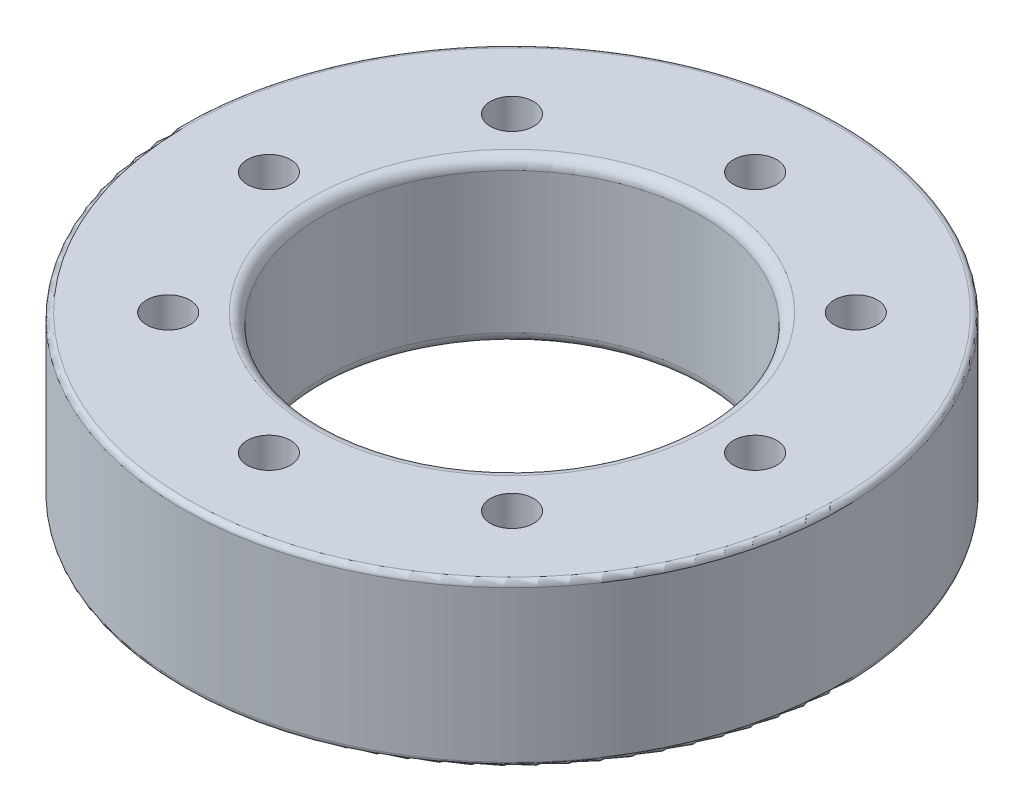
ISO-10303-21;
HEADER;
FILE_DESCRIPTION(('STEP AP214'),'2;1');
FILE_NAME('part.step','',(''),(''),'','','');
FILE_SCHEMA(('AUTOMOTIVE_DESIGN { 1 0 10303 214 1 1 1 1 }'));
ENDSEC;
DATA;
#1=APPLICATION_CONTEXT('core data for automotive mechanical design processes');
#2=APPLICATION_PROTOCOL_DEFINITION('international standard','automotive_design',2000,#1);
#3=PRODUCT_CONTEXT('',#1,'mechanical');
#4=PRODUCT('Part','Part','',(#3));
#5=PRODUCT_RELATED_PRODUCT_CATEGORY('part','',(#4));
#6=PRODUCT_DEFINITION_FORMATION('','',#4);
#7=PRODUCT_DEFINITION_CONTEXT('part definition',#1,'design');
#8=PRODUCT_DEFINITION('design','',#6,#7);
#9=PRODUCT_DEFINITION_SHAPE('','',#8);
#10=(LENGTH_UNIT() NAMED_UNIT(*) SI_UNIT(.MILLI.,.METRE.));
#11=(NAMED_UNIT(*) PLANE_ANGLE_UNIT() SI_UNIT($,.RADIAN.));
#12=(NAMED_UNIT(*) SI_UNIT($,.STERADIAN.) SOLID_ANGLE_UNIT());
#13=UNCERTAINTY_MEASURE_WITH_UNIT(LENGTH_MEASURE(1.E-05),#10,'distance_accuracy_value','');
#14=(GEOMETRIC_REPRESENTATION_CONTEXT(3) GLOBAL_UNCERTAINTY_ASSIGNED_CONTEXT((#13)) GLOBAL_UNIT_ASSIGNED_CONTEXT((#10,
#11,#12)) REPRESENTATION_CONTEXT('',''));
#15=CARTESIAN_POINT('',(0.,0.,0.));
#16=DIRECTION('',(0.,0.,1.));
#17=DIRECTION('',(1.,0.,0.));
#18=AXIS2_PLACEMENT_3D('',#15,#16,#17);
#19=CARTESIAN_POINT('',(0.,15.,0.));
#20=DIRECTION('',(0.,1.,0.));
#21=DIRECTION('',(0.,0.,1.));
#22=AXIS2_PLACEMENT_3D('',#19,#20,#21);
#23=PLANE('',#22);
#24=CARTESIAN_POINT('',(0.,15.,0.));
#25=DIRECTION('',(0.,1.,0.));
#26=DIRECTION('',(0.,0.,1.));
#27=AXIS2_PLACEMENT_3D('',#24,#25,#26);
#28=CIRCLE('',#27,30.);
#29=CARTESIAN_POINT('',(0.,15.,30.));
#30=VERTEX_POINT('',#29);
#31=EDGE_CURVE('E10',#30,#30,#28,.T.);
#32=ORIENTED_EDGE('',*,*,#31,.T.);
#33=EDGE_LOOP('',(#32));
#34=FACE_BOUND('',#33,.T.);
#35=CARTESIAN_POINT('',(0.,15.,0.));
#36=DIRECTION('',(0.,1.,0.));
#37=DIRECTION('',(0.,0.,1.));
#38=AXIS2_PLACEMENT_3D('',#35,#36,#37);
#39=CIRCLE('',#38,18.5);
#40=CARTESIAN_POINT('',(0.,15.,18.5));
#41=VERTEX_POINT('',#40);
#42=EDGE_CURVE('E57',#41,#41,#39,.F.);
#43=ORIENTED_EDGE('',*,*,#42,.T.);
#44=EDGE_LOOP('',(#43));
#45=FACE_BOUND('',#44,.T.);
#46=CARTESIAN_POINT('',(0.,15.,-22.5));
#47=DIRECTION('',(0.,1.,0.));
#48=DIRECTION('',(0.,0.,1.));
#49=AXIS2_PLACEMENT_3D('',#46,#47,#48);
#50=CIRCLE('',#49,2.);
#51=CARTESIAN_POINT('',(0.,15.,-20.5));
#52=VERTEX_POINT('',#51);
#53=EDGE_CURVE('E112',#52,#52,#50,.T.);
#54=ORIENTED_EDGE('',*,*,#53,.F.);
#55=EDGE_LOOP('',(#54));
#56=FACE_BOUND('',#55,.T.);
#57=CARTESIAN_POINT('',(15.9099025766974,15.,-15.9099025766973));
#58=DIRECTION('',(0.,1.,0.));
#59=DIRECTION('',(0.,0.,1.));
#60=AXIS2_PLACEMENT_3D('',#57,#58,#59);
#61=CIRCLE('',#60,2.);
#62=CARTESIAN_POINT('',(15.9099025766974,15.,-13.9099025766973));
#63=VERTEX_POINT('',#62);
#64=EDGE_CURVE('E109',#63,#63,#61,.T.);
#65=ORIENTED_EDGE('',*,*,#64,.F.);
#66=EDGE_LOOP('',(#65));
#67=FACE_BOUND('',#66,.T.);
#68=CARTESIAN_POINT('',(22.5,15.,0.));
#69=DIRECTION('',(0.,1.,0.));
#70=DIRECTION('',(0.,0.,1.));
#71=AXIS2_PLACEMENT_3D('',#68,#69,#70);
#72=CIRCLE('',#71,2.);
#73=CARTESIAN_POINT('',(22.5,15.,2.00000000000008));
#74=VERTEX_POINT('',#73);
#75=EDGE_CURVE('E103',#74,#74,#72,.T.);
#76=ORIENTED_EDGE('',*,*,#75,.F.);
#77=EDGE_LOOP('',(#76));
#78=FACE_BOUND('',#77,.T.);
#79=CARTESIAN_POINT('',(15.9099025766972,15.,15.9099025766974));
#80=DIRECTION('',(0.,1.,0.));
#81=DIRECTION('',(0.,0.,1.));
#82=AXIS2_PLACEMENT_3D('',#79,#80,#81);
#83=CIRCLE('',#82,2.);
#84=CARTESIAN_POINT('',(15.9099025766972,15.,17.9099025766974));
#85=VERTEX_POINT('',#84);
#86=EDGE_CURVE('E97',#85,#85,#83,.T.);
#87=ORIENTED_EDGE('',*,*,#86,.F.);
#88=EDGE_LOOP('',(#87));
#89=FACE_BOUND('',#88,.T.);
#90=CARTESIAN_POINT('',(-1.57116660247941E-13,15.,22.5));
#91=DIRECTION('',(0.,1.,0.));
#92=DIRECTION('',(0.,0.,1.));
#93=AXIS2_PLACEMENT_3D('',#90,#91,#92);
#94=CIRCLE('',#93,2.);
#95=CARTESIAN_POINT('',(-1.57116660247941E-13,15.,24.5));
#96=VERTEX_POINT('',#95);
#97=EDGE_CURVE('E91',#96,#96,#94,.T.);
#98=ORIENTED_EDGE('',*,*,#97,.F.);
#99=EDGE_LOOP('',(#98));
#100=FACE_BOUND('',#99,.T.);
#101=CARTESIAN_POINT('',(-15.9099025766975,15.,15.9099025766972));
#102=DIRECTION('',(0.,1.,0.));
#103=DIRECTION('',(0.,0.,1.));
#104=AXIS2_PLACEMENT_3D('',#101,#102,#103);
#105=CIRCLE('',#104,2.);
#106=CARTESIAN_POINT('',(-15.9099025766975,15.,17.9099025766972));
#107=VERTEX_POINT('',#106);
#108=EDGE_CURVE('E85',#107,#107,#105,.T.);
#109=ORIENTED_EDGE('',*,*,#108,.F.);
#110=EDGE_LOOP('',(#109));
#111=FACE_BOUND('',#110,.T.);
#112=CARTESIAN_POINT('',(-22.5,15.,-2.35674990371912E-13));
#113=DIRECTION('',(0.,1.,0.));
#114=DIRECTION('',(0.,0.,1.));
#115=AXIS2_PLACEMENT_3D('',#112,#113,#114);
#116=CIRCLE('',#115,2.);
#117=CARTESIAN_POINT('',(-22.5,15.,1.99999999999976));
#118=VERTEX_POINT('',#117);
#119=EDGE_CURVE('E79',#118,#118,#116,.T.);
#120=ORIENTED_EDGE('',*,*,#119,.F.);
#121=EDGE_LOOP('',(#120));
#122=FACE_BOUND('',#121,.T.);
#123=CARTESIAN_POINT('',(-15.9099025766971,15.,-15.9099025766975));
#124=DIRECTION('',(0.,1.,0.));
#125=DIRECTION('',(0.,0.,1.));
#126=AXIS2_PLACEMENT_3D('',#123,#124,#125);
#127=CIRCLE('',#126,2.);
#128=CARTESIAN_POINT('',(-15.9099025766971,15.,-13.9099025766975));
#129=VERTEX_POINT('',#128);
#130=EDGE_CURVE('E73',#129,#129,#127,.T.);
#131=ORIENTED_EDGE('',*,*,#130,.F.);
#132=EDGE_LOOP('',(#131));
#133=FACE_BOUND('',#132,.T.);
#134=ADVANCED_FACE('F37',(#34,#45,#56,#67,#78,#89,#100,#111,#122,#133),#23,.T.);
#135=CARTESIAN_POINT('',(0.,0.,0.));
#136=DIRECTION('',(0.,1.,0.));
#137=DIRECTION('',(0.,0.,1.));
#138=AXIS2_PLACEMENT_3D('',#135,#136,#137);
#139=PLANE('',#138);
#140=CARTESIAN_POINT('',(0.,0.,0.));
#141=DIRECTION('',(0.,1.,0.));
#142=DIRECTION('',(0.,0.,1.));
#143=AXIS2_PLACEMENT_3D('',#140,#141,#142);
#144=CIRCLE('',#143,30.);
#145=CARTESIAN_POINT('',(0.,0.,30.));
#146=VERTEX_POINT('',#145);
#147=EDGE_CURVE('E44',#146,#146,#144,.F.);
#148=ORIENTED_EDGE('',*,*,#147,.T.);
#149=EDGE_LOOP('',(#148));
#150=FACE_BOUND('',#149,.T.);
#151=CARTESIAN_POINT('',(0.,0.,0.));
#152=DIRECTION('',(0.,1.,0.));
#153=DIRECTION('',(0.,0.,1.));
#154=AXIS2_PLACEMENT_3D('',#151,#152,#153);
#155=CIRCLE('',#154,18.5);
#156=CARTESIAN_POINT('',(0.,0.,18.5));
#157=VERTEX_POINT('',#156);
#158=EDGE_CURVE('E66',#157,#157,#155,.T.);
#159=ORIENTED_EDGE('',*,*,#158,.T.);
#160=EDGE_LOOP('',(#159));
#161=FACE_BOUND('',#160,.T.);
#162=CARTESIAN_POINT('',(0.,0.,-22.5));
#163=DIRECTION('',(0.,1.,0.));
#164=DIRECTION('',(0.,0.,1.));
#165=AXIS2_PLACEMENT_3D('',#162,#163,#164);
#166=CIRCLE('',#165,2.);
#167=CARTESIAN_POINT('',(0.,0.,-20.5));
#168=VERTEX_POINT('',#167);
#169=EDGE_CURVE('E69',#168,#168,#166,.T.);
#170=ORIENTED_EDGE('',*,*,#169,.T.);
#171=EDGE_LOOP('',(#170));
#172=FACE_BOUND('',#171,.T.);
#173=CARTESIAN_POINT('',(15.9099025766974,0.,-15.9099025766973));
#174=DIRECTION('',(0.,1.,0.));
#175=DIRECTION('',(0.,0.,1.));
#176=AXIS2_PLACEMENT_3D('',#173,#174,#175);
#177=CIRCLE('',#176,2.);
#178=CARTESIAN_POINT('',(15.9099025766974,0.,-13.9099025766973));
#179=VERTEX_POINT('',#178);
#180=EDGE_CURVE('E106',#179,#179,#177,.T.);
#181=ORIENTED_EDGE('',*,*,#180,.T.);
#182=EDGE_LOOP('',(#181));
#183=FACE_BOUND('',#182,.T.);
#184=CARTESIAN_POINT('',(22.5,0.,0.));
#185=DIRECTION('',(0.,1.,0.));
#186=DIRECTION('',(0.,0.,1.));
#187=AXIS2_PLACEMENT_3D('',#184,#185,#186);
#188=CIRCLE('',#187,2.);
#189=CARTESIAN_POINT('',(22.5,0.,2.00000000000008));
#190=VERTEX_POINT('',#189);
#191=EDGE_CURVE('E100',#190,#190,#188,.T.);
#192=ORIENTED_EDGE('',*,*,#191,.T.);
#193=EDGE_LOOP('',(#192));
#194=FACE_BOUND('',#193,.T.);
#195=CARTESIAN_POINT('',(15.9099025766972,0.,15.9099025766974));
#196=DIRECTION('',(0.,1.,0.));
#197=DIRECTION('',(0.,0.,1.));
#198=AXIS2_PLACEMENT_3D('',#195,#196,#197);
#199=CIRCLE('',#198,2.);
#200=CARTESIAN_POINT('',(15.9099025766972,0.,17.9099025766974));
#201=VERTEX_POINT('',#200);
#202=EDGE_CURVE('E94',#201,#201,#199,.T.);
#203=ORIENTED_EDGE('',*,*,#202,.T.);
#204=EDGE_LOOP('',(#203));
#205=FACE_BOUND('',#204,.T.);
#206=CARTESIAN_POINT('',(-1.57116660247941E-13,0.,22.5));
#207=DIRECTION('',(0.,1.,0.));
#208=DIRECTION('',(0.,0.,1.));
#209=AXIS2_PLACEMENT_3D('',#206,#207,#208);
#210=CIRCLE('',#209,2.);
#211=CARTESIAN_POINT('',(-1.57116660247941E-13,0.,24.5));
#212=VERTEX_POINT('',#211);
#213=EDGE_CURVE('E88',#212,#212,#210,.T.);
#214=ORIENTED_EDGE('',*,*,#213,.T.);
#215=EDGE_LOOP('',(#214));
#216=FACE_BOUND('',#215,.T.);
#217=CARTESIAN_POINT('',(-15.9099025766975,0.,15.9099025766972));
#218=DIRECTION('',(0.,1.,0.));
#219=DIRECTION('',(0.,0.,1.));
#220=AXIS2_PLACEMENT_3D('',#217,#218,#219);
#221=CIRCLE('',#220,2.);
#222=CARTESIAN_POINT('',(-15.9099025766975,0.,17.9099025766972));
#223=VERTEX_POINT('',#222);
#224=EDGE_CURVE('E82',#223,#223,#221,.T.);
#225=ORIENTED_EDGE('',*,*,#224,.T.);
#226=EDGE_LOOP('',(#225));
#227=FACE_BOUND('',#226,.T.);
#228=CARTESIAN_POINT('',(-22.5,0.,-2.35674990371912E-13));
#229=DIRECTION('',(0.,1.,0.));
#230=DIRECTION('',(0.,0.,1.));
#231=AXIS2_PLACEMENT_3D('',#228,#229,#230);
#232=CIRCLE('',#231,2.);
#233=CARTESIAN_POINT('',(-22.5,0.,1.99999999999976));
#234=VERTEX_POINT('',#233);
#235=EDGE_CURVE('E76',#234,#234,#232,.T.);
#236=ORIENTED_EDGE('',*,*,#235,.T.);
#237=EDGE_LOOP('',(#236));
#238=FACE_BOUND('',#237,.T.);
#239=CARTESIAN_POINT('',(-15.9099025766971,0.,-15.9099025766975));
#240=DIRECTION('',(0.,1.,0.));
#241=DIRECTION('',(0.,0.,1.));
#242=AXIS2_PLACEMENT_3D('',#239,#240,#241);
#243=CIRCLE('',#242,2.);
#244=CARTESIAN_POINT('',(-15.9099025766971,0.,-13.9099025766975));
#245=VERTEX_POINT('',#244);
#246=EDGE_CURVE('E70',#245,#245,#243,.T.);
#247=ORIENTED_EDGE('',*,*,#246,.T.);
#248=EDGE_LOOP('',(#247));
#249=FACE_BOUND('',#248,.T.);
#250=ADVANCED_FACE('F118',(#150,#161,#172,#183,#194,#205,#216,#227,#238,#249),#139,.F.);
#251=CARTESIAN_POINT('',(0.,15.,0.));
#252=DIRECTION('',(0.,-1.,0.));
#253=DIRECTION('',(0.,0.,-1.));
#254=AXIS2_PLACEMENT_3D('',#251,#252,#253);
#255=CYLINDRICAL_SURFACE('',#254,30.5);
#256=CARTESIAN_POINT('',(0.,0.5,0.));
#257=DIRECTION('',(0.,1.,0.));
#258=DIRECTION('',(0.,0.,1.));
#259=AXIS2_PLACEMENT_3D('',#256,#257,#258);
#260=CIRCLE('',#259,30.5);
#261=CARTESIAN_POINT('',(0.,0.5,30.5));
#262=VERTEX_POINT('',#261);
#263=EDGE_CURVE('E48',#262,#262,#260,.T.);
#264=ORIENTED_EDGE('',*,*,#263,.T.);
#265=EDGE_LOOP('',(#264));
#266=FACE_BOUND('',#265,.T.);
#267=CARTESIAN_POINT('',(0.,14.5,0.));
#268=DIRECTION('',(0.,1.,0.));
#269=DIRECTION('',(0.,0.,1.));
#270=AXIS2_PLACEMENT_3D('',#267,#268,#269);
#271=CIRCLE('',#270,30.5);
#272=CARTESIAN_POINT('',(0.,14.5,30.5));
#273=VERTEX_POINT('',#272);
#274=EDGE_CURVE('E52',#273,#273,#271,.F.);
#275=ORIENTED_EDGE('',*,*,#274,.T.);
#276=EDGE_LOOP('',(#275));
#277=FACE_BOUND('',#276,.T.);
#278=ADVANCED_FACE('F159',(#266,#277),#255,.T.);
#279=CARTESIAN_POINT('',(0.,15.,0.));
#280=DIRECTION('',(0.,-1.,0.));
#281=DIRECTION('',(0.,0.,-1.));
#282=AXIS2_PLACEMENT_3D('',#279,#280,#281);
#283=CYLINDRICAL_SURFACE('',#282,17.5);
#284=CARTESIAN_POINT('',(0.,1.,0.));
#285=DIRECTION('',(0.,1.,0.));
#286=DIRECTION('',(0.,0.,1.));
#287=AXIS2_PLACEMENT_3D('',#284,#285,#286);
#288=CIRCLE('',#287,17.5);
#289=CARTESIAN_POINT('',(0.,1.,17.5));
#290=VERTEX_POINT('',#289);
#291=EDGE_CURVE('E60',#290,#290,#288,.F.);
#292=ORIENTED_EDGE('',*,*,#291,.T.);
#293=EDGE_LOOP('',(#292));
#294=FACE_BOUND('',#293,.T.);
#295=CARTESIAN_POINT('',(0.,14.,0.));
#296=DIRECTION('',(0.,1.,0.));
#297=DIRECTION('',(0.,0.,1.));
#298=AXIS2_PLACEMENT_3D('',#295,#296,#297);
#299=CIRCLE('',#298,17.5);
#300=CARTESIAN_POINT('',(0.,14.,17.5));
#301=VERTEX_POINT('',#300);
#302=EDGE_CURVE('E63',#301,#301,#299,.T.);
#303=ORIENTED_EDGE('',*,*,#302,.T.);
#304=EDGE_LOOP('',(#303));
#305=FACE_BOUND('',#304,.T.);
#306=ADVANCED_FACE('F149',(#294,#305),#283,.F.);
#307=CARTESIAN_POINT('',(-15.9099025766971,0.,-15.9099025766975));
#308=DIRECTION('',(0.,1.,0.));
#309=DIRECTION('',(0.,0.,1.));
#310=AXIS2_PLACEMENT_3D('',#307,#308,#309);
#311=CYLINDRICAL_SURFACE('',#310,2.);
#312=ORIENTED_EDGE('',*,*,#246,.F.);
#313=EDGE_LOOP('',(#312));
#314=FACE_BOUND('',#313,.T.);
#315=ORIENTED_EDGE('',*,*,#130,.T.);
#316=EDGE_LOOP('',(#315));
#317=FACE_BOUND('',#316,.T.);
#318=ADVANCED_FACE('F146',(#314,#317),#311,.F.);
#319=CARTESIAN_POINT('',(-22.5,0.,-2.35674990371912E-13));
#320=DIRECTION('',(0.,1.,0.));
#321=DIRECTION('',(0.,0.,1.));
#322=AXIS2_PLACEMENT_3D('',#319,#320,#321);
#323=CYLINDRICAL_SURFACE('',#322,2.);
#324=ORIENTED_EDGE('',*,*,#235,.F.);
#325=EDGE_LOOP('',(#324));
#326=FACE_BOUND('',#325,.T.);
#327=ORIENTED_EDGE('',*,*,#119,.T.);
#328=EDGE_LOOP('',(#327));
#329=FACE_BOUND('',#328,.T.);
#330=ADVANCED_FACE('F148',(#326,#329),#323,.F.);
#331=CARTESIAN_POINT('',(-15.9099025766975,0.,15.9099025766972));
#332=DIRECTION('',(0.,1.,0.));
#333=DIRECTION('',(0.,0.,1.));
#334=AXIS2_PLACEMENT_3D('',#331,#332,#333);
#335=CYLINDRICAL_SURFACE('',#334,2.);
#336=ORIENTED_EDGE('',*,*,#224,.F.);
#337=EDGE_LOOP('',(#336));
#338=FACE_BOUND('',#337,.T.);
#339=ORIENTED_EDGE('',*,*,#108,.T.);
#340=EDGE_LOOP('',(#339));
#341=FACE_BOUND('',#340,.T.);
#342=ADVANCED_FACE('F155',(#338,#341),#335,.F.);
#343=CARTESIAN_POINT('',(-1.57116660247941E-13,0.,22.5));
#344=DIRECTION('',(0.,1.,0.));
#345=DIRECTION('',(0.,0.,1.));
#346=AXIS2_PLACEMENT_3D('',#343,#344,#345);
#347=CYLINDRICAL_SURFACE('',#346,2.);
#348=ORIENTED_EDGE('',*,*,#213,.F.);
#349=EDGE_LOOP('',(#348));
#350=FACE_BOUND('',#349,.T.);
#351=ORIENTED_EDGE('',*,*,#97,.T.);
#352=EDGE_LOOP('',(#351));
#353=FACE_BOUND('',#352,.T.);
#354=ADVANCED_FACE('F242',(#350,#353),#347,.F.);
#355=CARTESIAN_POINT('',(15.9099025766972,0.,15.9099025766974));
#356=DIRECTION('',(0.,1.,0.));
#357=DIRECTION('',(0.,0.,1.));
#358=AXIS2_PLACEMENT_3D('',#355,#356,#357);
#359=CYLINDRICAL_SURFACE('',#358,2.);
#360=ORIENTED_EDGE('',*,*,#202,.F.);
#361=EDGE_LOOP('',(#360));
#362=FACE_BOUND('',#361,.T.);
#363=ORIENTED_EDGE('',*,*,#86,.T.);
#364=EDGE_LOOP('',(#363));
#365=FACE_BOUND('',#364,.T.);
#366=ADVANCED_FACE('F232',(#362,#365),#359,.F.);
#367=CARTESIAN_POINT('',(22.5,0.,0.));
#368=DIRECTION('',(0.,1.,0.));
#369=DIRECTION('',(0.,0.,1.));
#370=AXIS2_PLACEMENT_3D('',#367,#368,#369);
#371=CYLINDRICAL_SURFACE('',#370,2.);
#372=ORIENTED_EDGE('',*,*,#191,.F.);
#373=EDGE_LOOP('',(#372));
#374=FACE_BOUND('',#373,.T.);
#375=ORIENTED_EDGE('',*,*,#75,.T.);
#376=EDGE_LOOP('',(#375));
#377=FACE_BOUND('',#376,.T.);
#378=ADVANCED_FACE('F222',(#374,#377),#371,.F.);
#379=CARTESIAN_POINT('',(15.9099025766974,0.,-15.9099025766973));
#380=DIRECTION('',(0.,1.,0.));
#381=DIRECTION('',(0.,0.,1.));
#382=AXIS2_PLACEMENT_3D('',#379,#380,#381);
#383=CYLINDRICAL_SURFACE('',#382,2.);
#384=ORIENTED_EDGE('',*,*,#180,.F.);
#385=EDGE_LOOP('',(#384));
#386=FACE_BOUND('',#385,.T.);
#387=ORIENTED_EDGE('',*,*,#64,.T.);
#388=EDGE_LOOP('',(#387));
#389=FACE_BOUND('',#388,.T.);
#390=ADVANCED_FACE('F125',(#386,#389),#383,.F.);
#391=CARTESIAN_POINT('',(0.,0.,-22.5));
#392=DIRECTION('',(0.,1.,0.));
#393=DIRECTION('',(0.,0.,1.));
#394=AXIS2_PLACEMENT_3D('',#391,#392,#393);
#395=CYLINDRICAL_SURFACE('',#394,2.);
#396=ORIENTED_EDGE('',*,*,#169,.F.);
#397=EDGE_LOOP('',(#396));
#398=FACE_BOUND('',#397,.T.);
#399=ORIENTED_EDGE('',*,*,#53,.T.);
#400=EDGE_LOOP('',(#399));
#401=FACE_BOUND('',#400,.T.);
#402=ADVANCED_FACE('F121',(#398,#401),#395,.F.);
#403=CARTESIAN_POINT('',(0.,1.,0.));
#404=DIRECTION('',(0.,1.,0.));
#405=DIRECTION('',(0.,0.,1.));
#406=AXIS2_PLACEMENT_3D('',#403,#404,#405);
#407=TOROIDAL_SURFACE('',#406,18.5,1.);
#408=ORIENTED_EDGE('',*,*,#291,.F.);
#409=EDGE_LOOP('',(#408));
#410=FACE_BOUND('',#409,.T.);
#411=ORIENTED_EDGE('',*,*,#158,.F.);
#412=EDGE_LOOP('',(#411));
#413=FACE_BOUND('',#412,.T.);
#414=ADVANCED_FACE('F124',(#410,#413),#407,.T.);
#415=CARTESIAN_POINT('',(0.,14.,0.));
#416=DIRECTION('',(0.,1.,0.));
#417=DIRECTION('',(0.,0.,1.));
#418=AXIS2_PLACEMENT_3D('',#415,#416,#417);
#419=TOROIDAL_SURFACE('',#418,18.5,1.);
#420=ORIENTED_EDGE('',*,*,#42,.F.);
#421=EDGE_LOOP('',(#420));
#422=FACE_BOUND('',#421,.T.);
#423=ORIENTED_EDGE('',*,*,#302,.F.);
#424=EDGE_LOOP('',(#423));
#425=FACE_BOUND('',#424,.T.);
#426=ADVANCED_FACE('F172',(#422,#425),#419,.T.);
#427=CARTESIAN_POINT('',(0.,0.5,0.));
#428=DIRECTION('',(0.,1.,0.));
#429=DIRECTION('',(0.,0.,1.));
#430=AXIS2_PLACEMENT_3D('',#427,#428,#429);
#431=TOROIDAL_SURFACE('',#430,30.,0.5);
#432=ORIENTED_EDGE('',*,*,#147,.F.);
#433=EDGE_LOOP('',(#432));
#434=FACE_BOUND('',#433,.T.);
#435=ORIENTED_EDGE('',*,*,#263,.F.);
#436=EDGE_LOOP('',(#435));
#437=FACE_BOUND('',#436,.T.);
#438=ADVANCED_FACE('F175',(#434,#437),#431,.T.);
#439=CARTESIAN_POINT('',(0.,14.5,0.));
#440=DIRECTION('',(0.,1.,0.));
#441=DIRECTION('',(0.,0.,1.));
#442=AXIS2_PLACEMENT_3D('',#439,#440,#441);
#443=TOROIDAL_SURFACE('',#442,30.,0.5);
#444=ORIENTED_EDGE('',*,*,#274,.F.);
#445=EDGE_LOOP('',(#444));
#446=FACE_BOUND('',#445,.T.);
#447=ORIENTED_EDGE('',*,*,#31,.F.);
#448=EDGE_LOOP('',(#447));
#449=FACE_BOUND('',#448,.T.);
#450=ADVANCED_FACE('F39',(#446,#449),#443,.T.);
#451=CLOSED_SHELL('',(#134,#250,#278,#306,#318,#330,#342,#354,#366,#378,#390,#402,#414,#426,
#438,#450));
#452=MANIFOLD_SOLID_BREP('B2',#451);
#453=ADVANCED_BREP_SHAPE_REPRESENTATION('',(#18,#452),#14);
#454=SHAPE_DEFINITION_REPRESENTATION(#9,#453);
ENDSEC;
END-ISO-10303-21;
